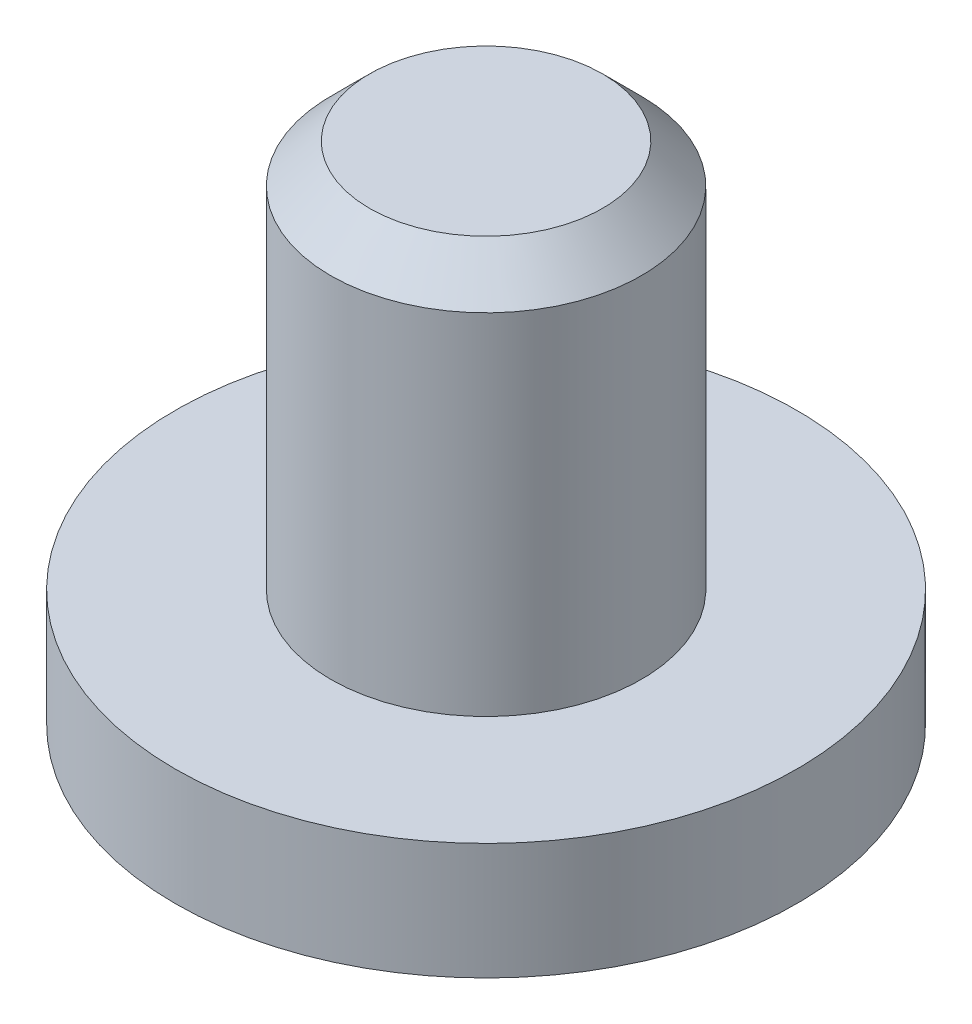
ISO-10303-21;
HEADER;
FILE_DESCRIPTION(('STEP AP214'),'2;1');
FILE_NAME('part.step','',(''),(''),'','','');
FILE_SCHEMA(('AUTOMOTIVE_DESIGN { 1 0 10303 214 1 1 1 1 }'));
ENDSEC;
DATA;
#1=APPLICATION_CONTEXT('core data for automotive mechanical design processes');
#2=APPLICATION_PROTOCOL_DEFINITION('international standard','automotive_design',2000,#1);
#3=PRODUCT_CONTEXT('',#1,'mechanical');
#4=PRODUCT('Part','Part','',(#3));
#5=PRODUCT_RELATED_PRODUCT_CATEGORY('part','',(#4));
#6=PRODUCT_DEFINITION_FORMATION('','',#4);
#7=PRODUCT_DEFINITION_CONTEXT('part definition',#1,'design');
#8=PRODUCT_DEFINITION('design','',#6,#7);
#9=PRODUCT_DEFINITION_SHAPE('','',#8);
#10=(LENGTH_UNIT() NAMED_UNIT(*) SI_UNIT(.MILLI.,.METRE.));
#11=(NAMED_UNIT(*) PLANE_ANGLE_UNIT() SI_UNIT($,.RADIAN.));
#12=(NAMED_UNIT(*) SI_UNIT($,.STERADIAN.) SOLID_ANGLE_UNIT());
#13=UNCERTAINTY_MEASURE_WITH_UNIT(LENGTH_MEASURE(1.E-05),#10,'distance_accuracy_value','');
#14=(GEOMETRIC_REPRESENTATION_CONTEXT(3) GLOBAL_UNCERTAINTY_ASSIGNED_CONTEXT((#13)) GLOBAL_UNIT_ASSIGNED_CONTEXT((#10,
#11,#12)) REPRESENTATION_CONTEXT('',''));
#15=CARTESIAN_POINT('',(0.,0.,0.));
#16=DIRECTION('',(0.,0.,1.));
#17=DIRECTION('',(1.,0.,0.));
#18=AXIS2_PLACEMENT_3D('',#15,#16,#17);
#19=CARTESIAN_POINT('',(0.,0.,0.));
#20=DIRECTION('',(0.,1.,0.));
#21=DIRECTION('',(0.,0.,1.));
#22=AXIS2_PLACEMENT_3D('',#19,#20,#21);
#23=PLANE('',#22);
#24=CARTESIAN_POINT('',(0.,0.,0.));
#25=DIRECTION('',(0.,1.,0.));
#26=DIRECTION('',(0.,0.,1.));
#27=AXIS2_PLACEMENT_3D('',#24,#25,#26);
#28=CIRCLE('',#27,4.);
#29=CARTESIAN_POINT('',(0.,0.,4.));
#30=VERTEX_POINT('',#29);
#31=EDGE_CURVE('E47',#30,#30,#28,.T.);
#32=ORIENTED_EDGE('',*,*,#31,.F.);
#33=EDGE_LOOP('',(#32));
#34=FACE_BOUND('',#33,.T.);
#35=ADVANCED_FACE('F35',(#34),#23,.F.);
#36=CARTESIAN_POINT('',(0.,6.5,0.));
#37=DIRECTION('',(0.,1.,0.));
#38=DIRECTION('',(0.,0.,1.));
#39=AXIS2_PLACEMENT_3D('',#36,#37,#38);
#40=CYLINDRICAL_SURFACE('',#39,4.);
#41=CARTESIAN_POINT('',(0.,1.5,0.));
#42=DIRECTION('',(0.,1.,0.));
#43=DIRECTION('',(0.,0.,1.));
#44=AXIS2_PLACEMENT_3D('',#41,#42,#43);
#45=CIRCLE('',#44,4.);
#46=CARTESIAN_POINT('',(0.,1.5,4.));
#47=VERTEX_POINT('',#46);
#48=EDGE_CURVE('E51',#47,#47,#45,.T.);
#49=ORIENTED_EDGE('',*,*,#48,.F.);
#50=EDGE_LOOP('',(#49));
#51=FACE_BOUND('',#50,.T.);
#52=ORIENTED_EDGE('',*,*,#31,.T.);
#53=EDGE_LOOP('',(#52));
#54=FACE_BOUND('',#53,.T.);
#55=ADVANCED_FACE('F65',(#51,#54),#40,.T.);
#56=CARTESIAN_POINT('',(4.,1.5,0.));
#57=DIRECTION('',(0.,-1.,0.));
#58=DIRECTION('',(0.,0.,-1.));
#59=AXIS2_PLACEMENT_3D('',#56,#57,#58);
#60=PLANE('',#59);
#61=CARTESIAN_POINT('',(0.,1.5,0.));
#62=DIRECTION('',(0.,1.,0.));
#63=DIRECTION('',(0.,0.,1.));
#64=AXIS2_PLACEMENT_3D('',#61,#62,#63);
#65=CIRCLE('',#64,2.);
#66=CARTESIAN_POINT('',(0.,1.5,2.));
#67=VERTEX_POINT('',#66);
#68=EDGE_CURVE('E56',#67,#67,#65,.T.);
#69=ORIENTED_EDGE('',*,*,#68,.F.);
#70=EDGE_LOOP('',(#69));
#71=FACE_BOUND('',#70,.T.);
#72=ORIENTED_EDGE('',*,*,#48,.T.);
#73=EDGE_LOOP('',(#72));
#74=FACE_BOUND('',#73,.T.);
#75=ADVANCED_FACE('F62',(#71,#74),#60,.F.);
#76=CARTESIAN_POINT('',(0.,6.5,0.));
#77=DIRECTION('',(0.,1.,0.));
#78=DIRECTION('',(0.,0.,1.));
#79=AXIS2_PLACEMENT_3D('',#76,#77,#78);
#80=CYLINDRICAL_SURFACE('',#79,2.);
#81=CARTESIAN_POINT('',(0.,6.,0.));
#82=DIRECTION('',(0.,-1.,0.));
#83=DIRECTION('',(0.,0.,-1.));
#84=AXIS2_PLACEMENT_3D('',#81,#82,#83);
#85=CIRCLE('',#84,2.);
#86=CARTESIAN_POINT('',(0.,6.,-2.));
#87=VERTEX_POINT('',#86);
#88=EDGE_CURVE('E10',#87,#87,#85,.T.);
#89=ORIENTED_EDGE('',*,*,#88,.T.);
#90=EDGE_LOOP('',(#89));
#91=FACE_BOUND('',#90,.T.);
#92=ORIENTED_EDGE('',*,*,#68,.T.);
#93=EDGE_LOOP('',(#92));
#94=FACE_BOUND('',#93,.T.);
#95=ADVANCED_FACE('F60',(#91,#94),#80,.T.);
#96=CARTESIAN_POINT('',(2.,6.5,0.));
#97=DIRECTION('',(0.,-1.,0.));
#98=DIRECTION('',(0.,0.,-1.));
#99=AXIS2_PLACEMENT_3D('',#96,#97,#98);
#100=PLANE('',#99);
#101=CARTESIAN_POINT('',(0.,6.5,0.));
#102=DIRECTION('',(0.,-1.,0.));
#103=DIRECTION('',(0.,0.,-1.));
#104=AXIS2_PLACEMENT_3D('',#101,#102,#103);
#105=CIRCLE('',#104,1.5);
#106=CARTESIAN_POINT('',(0.,6.5,-1.5));
#107=VERTEX_POINT('',#106);
#108=EDGE_CURVE('E43',#107,#107,#105,.F.);
#109=ORIENTED_EDGE('',*,*,#108,.T.);
#110=EDGE_LOOP('',(#109));
#111=FACE_BOUND('',#110,.T.);
#112=ADVANCED_FACE('F80',(#111),#100,.F.);
#113=CARTESIAN_POINT('',(0.,6.5,0.));
#114=DIRECTION('',(0.,-1.,0.));
#115=DIRECTION('',(0.,0.,-1.));
#116=AXIS2_PLACEMENT_3D('',#113,#114,#115);
#117=CONICAL_SURFACE('',#116,1.5,0.785398163397447);
#118=ORIENTED_EDGE('',*,*,#88,.F.);
#119=EDGE_LOOP('',(#118));
#120=FACE_BOUND('',#119,.T.);
#121=ORIENTED_EDGE('',*,*,#108,.F.);
#122=EDGE_LOOP('',(#121));
#123=FACE_BOUND('',#122,.T.);
#124=ADVANCED_FACE('F38',(#120,#123),#117,.T.);
#125=CLOSED_SHELL('',(#35,#55,#75,#95,#112,#124));
#126=MANIFOLD_SOLID_BREP('B2',#125);
#127=ADVANCED_BREP_SHAPE_REPRESENTATION('',(#18,#126),#14);
#128=SHAPE_DEFINITION_REPRESENTATION(#9,#127);
ENDSEC;
END-ISO-10303-21;
